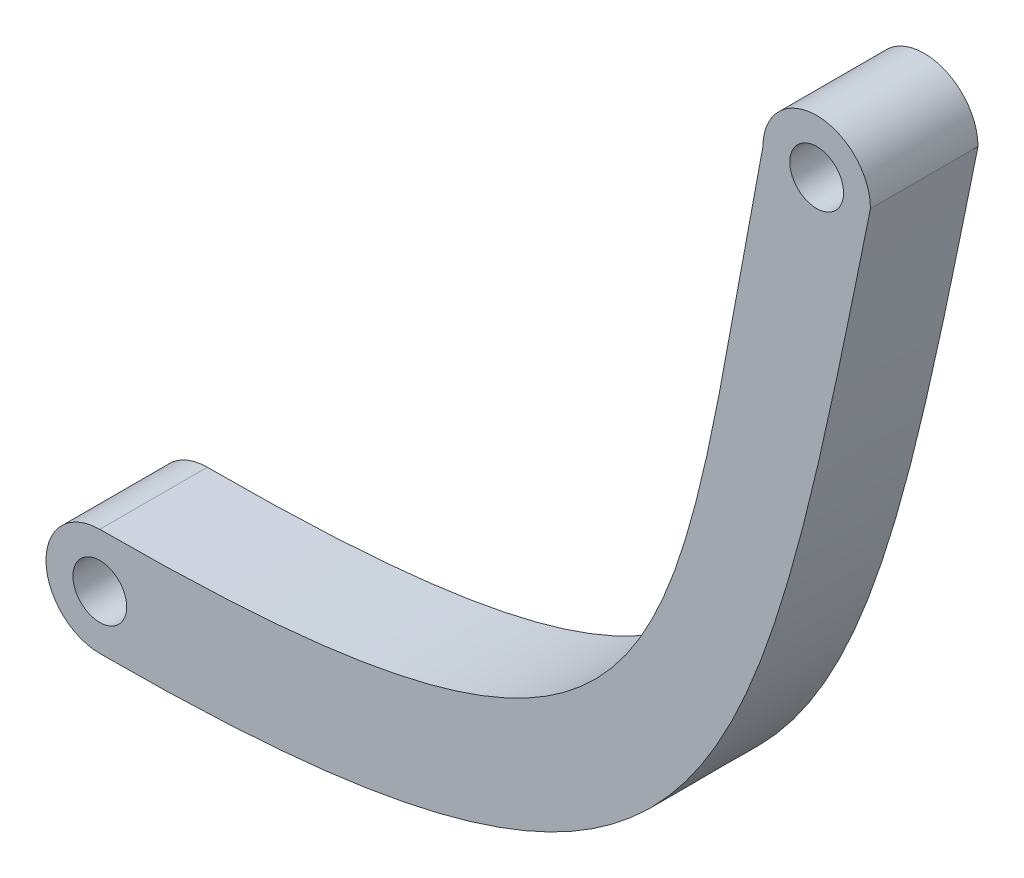
ISO-10303-21;
HEADER;
FILE_DESCRIPTION(('STEP AP214'),'2;1');
FILE_NAME('part.step','',(''),(''),'','','');
FILE_SCHEMA(('AUTOMOTIVE_DESIGN { 1 0 10303 214 1 1 1 1 }'));
ENDSEC;
DATA;
#1=APPLICATION_CONTEXT('core data for automotive mechanical design processes');
#2=APPLICATION_PROTOCOL_DEFINITION('international standard','automotive_design',2000,#1);
#3=PRODUCT_CONTEXT('',#1,'mechanical');
#4=PRODUCT('Part','Part','',(#3));
#5=PRODUCT_RELATED_PRODUCT_CATEGORY('part','',(#4));
#6=PRODUCT_DEFINITION_FORMATION('','',#4);
#7=PRODUCT_DEFINITION_CONTEXT('part definition',#1,'design');
#8=PRODUCT_DEFINITION('design','',#6,#7);
#9=PRODUCT_DEFINITION_SHAPE('','',#8);
#10=(LENGTH_UNIT() NAMED_UNIT(*) SI_UNIT(.MILLI.,.METRE.));
#11=(NAMED_UNIT(*) PLANE_ANGLE_UNIT() SI_UNIT($,.RADIAN.));
#12=(NAMED_UNIT(*) SI_UNIT($,.STERADIAN.) SOLID_ANGLE_UNIT());
#13=UNCERTAINTY_MEASURE_WITH_UNIT(LENGTH_MEASURE(1.E-05),#10,'distance_accuracy_value','');
#14=(GEOMETRIC_REPRESENTATION_CONTEXT(3) GLOBAL_UNCERTAINTY_ASSIGNED_CONTEXT((#13)) GLOBAL_UNIT_ASSIGNED_CONTEXT((#10,
#11,#12)) REPRESENTATION_CONTEXT('',''));
#15=CARTESIAN_POINT('',(0.,0.,0.));
#16=DIRECTION('',(0.,0.,1.));
#17=DIRECTION('',(1.,0.,0.));
#18=AXIS2_PLACEMENT_3D('',#15,#16,#17);
#19=CARTESIAN_POINT('',(0.,0.,-3.));
#20=DIRECTION('',(0.,0.,1.));
#21=DIRECTION('',(1.,0.,0.));
#22=AXIS2_PLACEMENT_3D('',#19,#20,#21);
#23=CYLINDRICAL_SURFACE('',#22,3.);
#24=DIRECTION('',(0.,0.,1.));
#25=VECTOR('',#24,1.);
#26=CARTESIAN_POINT('',(0.,-3.,-3.));
#27=LINE('',#26,#25);
#28=CARTESIAN_POINT('',(0.,-3.,-3.));
#29=VERTEX_POINT('',#28);
#30=CARTESIAN_POINT('',(0.,-3.,3.));
#31=VERTEX_POINT('',#30);
#32=EDGE_CURVE('E136',#29,#31,#27,.T.);
#33=ORIENTED_EDGE('',*,*,#32,.T.);
#34=CARTESIAN_POINT('',(0.,0.,3.));
#35=DIRECTION('',(0.,0.,1.));
#36=DIRECTION('',(1.,0.,0.));
#37=AXIS2_PLACEMENT_3D('',#34,#35,#36);
#38=CIRCLE('',#37,3.);
#39=CARTESIAN_POINT('',(0.,3.,3.));
#40=VERTEX_POINT('',#39);
#41=EDGE_CURVE('E173',#40,#31,#38,.T.);
#42=ORIENTED_EDGE('',*,*,#41,.F.);
#43=DIRECTION('',(0.,0.,1.));
#44=VECTOR('',#43,1.);
#45=CARTESIAN_POINT('',(0.,3.,-3.));
#46=LINE('',#45,#44);
#47=CARTESIAN_POINT('',(0.,3.,-3.));
#48=VERTEX_POINT('',#47);
#49=EDGE_CURVE('E12',#48,#40,#46,.T.);
#50=ORIENTED_EDGE('',*,*,#49,.F.);
#51=CARTESIAN_POINT('',(0.,0.,-3.));
#52=DIRECTION('',(0.,0.,1.));
#53=DIRECTION('',(1.,0.,0.));
#54=AXIS2_PLACEMENT_3D('',#51,#52,#53);
#55=CIRCLE('',#54,3.);
#56=EDGE_CURVE('E175',#48,#29,#55,.T.);
#57=ORIENTED_EDGE('',*,*,#56,.T.);
#58=EDGE_LOOP('',(#33,#42,#50,#57));
#59=FACE_BOUND('',#58,.T.);
#60=ADVANCED_FACE('F133',(#59),#23,.T.);
#61=CARTESIAN_POINT('',(0.,3.,-3.));
#62=CARTESIAN_POINT('',(33.3333333333334,3.,-3.));
#63=CARTESIAN_POINT('',(31.6647291709544,12.3590615975105,-3.));
#64=CARTESIAN_POINT('',(37.,40.,-3.));
#65=B_SPLINE_CURVE_WITH_KNOTS('',3,(#61,#62,#63,#64),.UNSPECIFIED.,.F.,.F.,(4,4),(0.,1.),.UNSPECIFIED.);
#66=DIRECTION('',(0.,0.,1.));
#67=VECTOR('',#66,1.);
#68=SURFACE_OF_LINEAR_EXTRUSION('',#65,#67);
#69=ORIENTED_EDGE('',*,*,#49,.T.);
#70=CARTESIAN_POINT('',(0.,3.,3.));
#71=CARTESIAN_POINT('',(33.3333333333334,3.,3.));
#72=CARTESIAN_POINT('',(31.6647291709544,12.3590615975105,3.));
#73=CARTESIAN_POINT('',(37.,40.,3.));
#74=B_SPLINE_CURVE_WITH_KNOTS('',3,(#70,#71,#72,#73),.UNSPECIFIED.,.F.,.F.,(4,4),(0.,1.),.UNSPECIFIED.);
#75=CARTESIAN_POINT('',(37.,40.,3.));
#76=VERTEX_POINT('',#75);
#77=EDGE_CURVE('E192',#40,#76,#74,.T.);
#78=ORIENTED_EDGE('',*,*,#77,.T.);
#79=DIRECTION('',(0.,0.,1.));
#80=VECTOR('',#79,1.);
#81=CARTESIAN_POINT('',(37.,40.,-3.));
#82=LINE('',#81,#80);
#83=CARTESIAN_POINT('',(37.,40.,-3.));
#84=VERTEX_POINT('',#83);
#85=EDGE_CURVE('E141',#84,#76,#82,.T.);
#86=ORIENTED_EDGE('',*,*,#85,.F.);
#87=EDGE_CURVE('E154',#48,#84,#65,.T.);
#88=ORIENTED_EDGE('',*,*,#87,.F.);
#89=EDGE_LOOP('',(#69,#78,#86,#88));
#90=FACE_BOUND('',#89,.T.);
#91=ADVANCED_FACE('F235',(#90),#68,.F.);
#92=CARTESIAN_POINT('',(40.,40.,-3.));
#93=DIRECTION('',(0.,0.,1.));
#94=DIRECTION('',(1.,0.,0.));
#95=AXIS2_PLACEMENT_3D('',#92,#93,#94);
#96=CYLINDRICAL_SURFACE('',#95,3.);
#97=ORIENTED_EDGE('',*,*,#85,.T.);
#98=CARTESIAN_POINT('',(40.,40.,3.));
#99=DIRECTION('',(0.,0.,-1.));
#100=DIRECTION('',(-1.,0.,0.));
#101=AXIS2_PLACEMENT_3D('',#98,#99,#100);
#102=CIRCLE('',#101,3.);
#103=CARTESIAN_POINT('',(43.,40.,3.));
#104=VERTEX_POINT('',#103);
#105=EDGE_CURVE('E187',#76,#104,#102,.T.);
#106=ORIENTED_EDGE('',*,*,#105,.T.);
#107=DIRECTION('',(0.,0.,1.));
#108=VECTOR('',#107,1.);
#109=CARTESIAN_POINT('',(43.,40.,-3.));
#110=LINE('',#109,#108);
#111=CARTESIAN_POINT('',(43.,40.,-3.));
#112=VERTEX_POINT('',#111);
#113=EDGE_CURVE('E179',#112,#104,#110,.T.);
#114=ORIENTED_EDGE('',*,*,#113,.F.);
#115=CARTESIAN_POINT('',(40.,40.,-3.));
#116=DIRECTION('',(0.,0.,-1.));
#117=DIRECTION('',(-1.,0.,0.));
#118=AXIS2_PLACEMENT_3D('',#115,#116,#117);
#119=CIRCLE('',#118,3.);
#120=EDGE_CURVE('E224',#84,#112,#119,.T.);
#121=ORIENTED_EDGE('',*,*,#120,.F.);
#122=EDGE_LOOP('',(#97,#106,#114,#121));
#123=FACE_BOUND('',#122,.T.);
#124=ADVANCED_FACE('F232',(#123),#96,.T.);
#125=CARTESIAN_POINT('',(0.,-3.,-3.));
#126=CARTESIAN_POINT('',(34.5473764028685,-3.00000000000001,-3.));
#127=CARTESIAN_POINT('',(36.3595320728019,7.33479991154238,-3.));
#128=CARTESIAN_POINT('',(43.,40.,-3.));
#129=B_SPLINE_CURVE_WITH_KNOTS('',3,(#125,#126,#127,#128),.UNSPECIFIED.,.F.,.F.,(4,4),(0.,1.),.UNSPECIFIED.);
#130=DIRECTION('',(0.,0.,1.));
#131=VECTOR('',#130,1.);
#132=SURFACE_OF_LINEAR_EXTRUSION('',#129,#131);
#133=ORIENTED_EDGE('',*,*,#113,.T.);
#134=CARTESIAN_POINT('',(0.,-3.,3.));
#135=CARTESIAN_POINT('',(34.5473764028685,-3.00000000000001,3.));
#136=CARTESIAN_POINT('',(36.3595320728019,7.33479991154238,3.));
#137=CARTESIAN_POINT('',(43.,40.,3.));
#138=B_SPLINE_CURVE_WITH_KNOTS('',3,(#134,#135,#136,#137),.UNSPECIFIED.,.F.,.F.,(4,4),(0.,1.),.UNSPECIFIED.);
#139=EDGE_CURVE('E181',#31,#104,#138,.T.);
#140=ORIENTED_EDGE('',*,*,#139,.F.);
#141=ORIENTED_EDGE('',*,*,#32,.F.);
#142=EDGE_CURVE('E219',#29,#112,#129,.T.);
#143=ORIENTED_EDGE('',*,*,#142,.T.);
#144=EDGE_LOOP('',(#133,#140,#141,#143));
#145=FACE_BOUND('',#144,.T.);
#146=ADVANCED_FACE('F182',(#145),#132,.T.);
#147=CARTESIAN_POINT('',(0.,0.,-3.));
#148=DIRECTION('',(0.,0.,1.));
#149=DIRECTION('',(1.,0.,0.));
#150=AXIS2_PLACEMENT_3D('',#147,#148,#149);
#151=PLANE('',#150);
#152=CARTESIAN_POINT('',(40.,40.,-3.));
#153=DIRECTION('',(0.,0.,1.));
#154=DIRECTION('',(1.,0.,0.));
#155=AXIS2_PLACEMENT_3D('',#152,#153,#154);
#156=CIRCLE('',#155,1.5);
#157=CARTESIAN_POINT('',(41.5,40.,-3.));
#158=VERTEX_POINT('',#157);
#159=EDGE_CURVE('E209',#158,#158,#156,.T.);
#160=ORIENTED_EDGE('',*,*,#159,.T.);
#161=EDGE_LOOP('',(#160));
#162=FACE_BOUND('',#161,.T.);
#163=CARTESIAN_POINT('',(0.,0.,-3.));
#164=DIRECTION('',(0.,0.,1.));
#165=DIRECTION('',(1.,0.,0.));
#166=AXIS2_PLACEMENT_3D('',#163,#164,#165);
#167=CIRCLE('',#166,1.5);
#168=CARTESIAN_POINT('',(1.5,0.,-3.));
#169=VERTEX_POINT('',#168);
#170=EDGE_CURVE('E215',#169,#169,#167,.T.);
#171=ORIENTED_EDGE('',*,*,#170,.T.);
#172=EDGE_LOOP('',(#171));
#173=FACE_BOUND('',#172,.T.);
#174=ORIENTED_EDGE('',*,*,#56,.F.);
#175=ORIENTED_EDGE('',*,*,#87,.T.);
#176=ORIENTED_EDGE('',*,*,#120,.T.);
#177=ORIENTED_EDGE('',*,*,#142,.F.);
#178=EDGE_LOOP('',(#174,#175,#176,#177));
#179=FACE_BOUND('',#178,.T.);
#180=ADVANCED_FACE('F231',(#162,#173,#179),#151,.F.);
#181=CARTESIAN_POINT('',(0.,0.,-3.));
#182=DIRECTION('',(0.,0.,1.));
#183=DIRECTION('',(1.,0.,0.));
#184=AXIS2_PLACEMENT_3D('',#181,#182,#183);
#185=CYLINDRICAL_SURFACE('',#184,1.5);
#186=ORIENTED_EDGE('',*,*,#170,.F.);
#187=EDGE_LOOP('',(#186));
#188=FACE_BOUND('',#187,.T.);
#189=CARTESIAN_POINT('',(0.,0.,3.));
#190=DIRECTION('',(0.,0.,1.));
#191=DIRECTION('',(1.,0.,0.));
#192=AXIS2_PLACEMENT_3D('',#189,#190,#191);
#193=CIRCLE('',#192,1.5);
#194=CARTESIAN_POINT('',(1.5,0.,3.));
#195=VERTEX_POINT('',#194);
#196=EDGE_CURVE('E193',#195,#195,#193,.T.);
#197=ORIENTED_EDGE('',*,*,#196,.T.);
#198=EDGE_LOOP('',(#197));
#199=FACE_BOUND('',#198,.T.);
#200=ADVANCED_FACE('F250',(#188,#199),#185,.F.);
#201=CARTESIAN_POINT('',(40.,40.,-3.));
#202=DIRECTION('',(0.,0.,1.));
#203=DIRECTION('',(1.,0.,0.));
#204=AXIS2_PLACEMENT_3D('',#201,#202,#203);
#205=CYLINDRICAL_SURFACE('',#204,1.5);
#206=ORIENTED_EDGE('',*,*,#159,.F.);
#207=EDGE_LOOP('',(#206));
#208=FACE_BOUND('',#207,.T.);
#209=CARTESIAN_POINT('',(40.,40.,3.));
#210=DIRECTION('',(0.,0.,1.));
#211=DIRECTION('',(1.,0.,0.));
#212=AXIS2_PLACEMENT_3D('',#209,#210,#211);
#213=CIRCLE('',#212,1.5);
#214=CARTESIAN_POINT('',(41.5,40.,3.));
#215=VERTEX_POINT('',#214);
#216=EDGE_CURVE('E196',#215,#215,#213,.T.);
#217=ORIENTED_EDGE('',*,*,#216,.T.);
#218=EDGE_LOOP('',(#217));
#219=FACE_BOUND('',#218,.T.);
#220=ADVANCED_FACE('F255',(#208,#219),#205,.F.);
#221=CARTESIAN_POINT('',(0.,0.,3.));
#222=DIRECTION('',(0.,0.,1.));
#223=DIRECTION('',(1.,0.,0.));
#224=AXIS2_PLACEMENT_3D('',#221,#222,#223);
#225=PLANE('',#224);
#226=ORIENTED_EDGE('',*,*,#196,.F.);
#227=EDGE_LOOP('',(#226));
#228=FACE_BOUND('',#227,.T.);
#229=ORIENTED_EDGE('',*,*,#41,.T.);
#230=ORIENTED_EDGE('',*,*,#139,.T.);
#231=ORIENTED_EDGE('',*,*,#105,.F.);
#232=ORIENTED_EDGE('',*,*,#77,.F.);
#233=EDGE_LOOP('',(#229,#230,#231,#232));
#234=FACE_BOUND('',#233,.T.);
#235=ORIENTED_EDGE('',*,*,#216,.F.);
#236=EDGE_LOOP('',(#235));
#237=FACE_BOUND('',#236,.T.);
#238=ADVANCED_FACE('F189',(#228,#234,#237),#225,.T.);
#239=CLOSED_SHELL('',(#60,#91,#124,#146,#180,#200,#220,#238));
#240=MANIFOLD_SOLID_BREP('B2',#239);
#241=ADVANCED_BREP_SHAPE_REPRESENTATION('',(#18,#240),#14);
#242=SHAPE_DEFINITION_REPRESENTATION(#9,#241);
ENDSEC;
END-ISO-10303-21;
